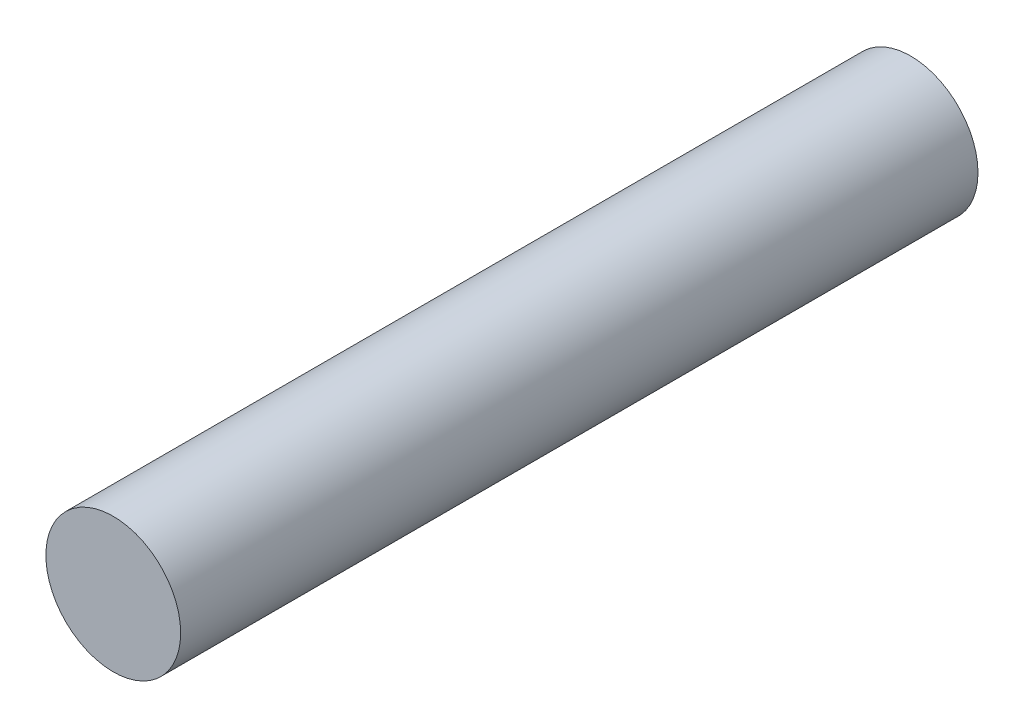
ISO-10303-21;
HEADER;
FILE_DESCRIPTION(('STEP AP214'),'2;1');
FILE_NAME('part.step','',(''),(''),'','','');
FILE_SCHEMA(('AUTOMOTIVE_DESIGN { 1 0 10303 214 1 1 1 1 }'));
ENDSEC;
DATA;
#1=APPLICATION_CONTEXT('core data for automotive mechanical design processes');
#2=APPLICATION_PROTOCOL_DEFINITION('international standard','automotive_design',2000,#1);
#3=PRODUCT_CONTEXT('',#1,'mechanical');
#4=PRODUCT('Part','Part','',(#3));
#5=PRODUCT_RELATED_PRODUCT_CATEGORY('part','',(#4));
#6=PRODUCT_DEFINITION_FORMATION('','',#4);
#7=PRODUCT_DEFINITION_CONTEXT('part definition',#1,'design');
#8=PRODUCT_DEFINITION('design','',#6,#7);
#9=PRODUCT_DEFINITION_SHAPE('','',#8);
#10=(LENGTH_UNIT() NAMED_UNIT(*) SI_UNIT(.MILLI.,.METRE.));
#11=(NAMED_UNIT(*) PLANE_ANGLE_UNIT() SI_UNIT($,.RADIAN.));
#12=(NAMED_UNIT(*) SI_UNIT($,.STERADIAN.) SOLID_ANGLE_UNIT());
#13=UNCERTAINTY_MEASURE_WITH_UNIT(LENGTH_MEASURE(1.E-05),#10,'distance_accuracy_value','');
#14=(GEOMETRIC_REPRESENTATION_CONTEXT(3) GLOBAL_UNCERTAINTY_ASSIGNED_CONTEXT((#13)) GLOBAL_UNIT_ASSIGNED_CONTEXT((#10,
#11,#12)) REPRESENTATION_CONTEXT('',''));
#15=CARTESIAN_POINT('',(0.,0.,0.));
#16=DIRECTION('',(0.,0.,1.));
#17=DIRECTION('',(1.,0.,0.));
#18=AXIS2_PLACEMENT_3D('',#15,#16,#17);
#19=CARTESIAN_POINT('',(6.23338385328465,6.25212212829109,29.5));
#20=DIRECTION('',(0.,0.,-1.));
#21=DIRECTION('',(-1.,0.,0.));
#22=AXIS2_PLACEMENT_3D('',#19,#20,#21);
#23=CYLINDRICAL_SURFACE('',#22,2.49364062066099);
#24=CARTESIAN_POINT('',(6.23338385328465,6.25212212829109,29.5));
#25=DIRECTION('',(0.,0.,1.));
#26=DIRECTION('',(1.,0.,0.));
#27=AXIS2_PLACEMENT_3D('',#24,#25,#26);
#28=CIRCLE('',#27,2.49364062066099);
#29=CARTESIAN_POINT('',(8.72702447394563,6.25212212829109,29.5));
#30=VERTEX_POINT('',#29);
#31=EDGE_CURVE('E10',#30,#30,#28,.T.);
#32=ORIENTED_EDGE('',*,*,#31,.F.);
#33=EDGE_LOOP('',(#32));
#34=FACE_BOUND('',#33,.T.);
#35=CARTESIAN_POINT('',(6.23338385328465,6.25212212829109,0.));
#36=DIRECTION('',(0.,0.,1.));
#37=DIRECTION('',(1.,0.,0.));
#38=AXIS2_PLACEMENT_3D('',#35,#36,#37);
#39=CIRCLE('',#38,2.49364062066099);
#40=CARTESIAN_POINT('',(8.72702447394563,6.25212212829109,0.));
#41=VERTEX_POINT('',#40);
#42=EDGE_CURVE('E40',#41,#41,#39,.T.);
#43=ORIENTED_EDGE('',*,*,#42,.T.);
#44=EDGE_LOOP('',(#43));
#45=FACE_BOUND('',#44,.T.);
#46=ADVANCED_FACE('F37',(#34,#45),#23,.T.);
#47=CARTESIAN_POINT('',(6.23338385328465,6.25212212829109,29.5));
#48=DIRECTION('',(0.,0.,1.));
#49=DIRECTION('',(1.,0.,0.));
#50=AXIS2_PLACEMENT_3D('',#47,#48,#49);
#51=PLANE('',#50);
#52=ORIENTED_EDGE('',*,*,#31,.T.);
#53=EDGE_LOOP('',(#52));
#54=FACE_BOUND('',#53,.T.);
#55=ADVANCED_FACE('F52',(#54),#51,.T.);
#56=CARTESIAN_POINT('',(6.23338385328465,6.25212212829109,0.));
#57=DIRECTION('',(0.,0.,1.));
#58=DIRECTION('',(1.,0.,0.));
#59=AXIS2_PLACEMENT_3D('',#56,#57,#58);
#60=PLANE('',#59);
#61=ORIENTED_EDGE('',*,*,#42,.F.);
#62=EDGE_LOOP('',(#61));
#63=FACE_BOUND('',#62,.T.);
#64=ADVANCED_FACE('F50',(#63),#60,.F.);
#65=CLOSED_SHELL('',(#46,#55,#64));
#66=MANIFOLD_SOLID_BREP('B2',#65);
#67=ADVANCED_BREP_SHAPE_REPRESENTATION('',(#18,#66),#14);
#68=SHAPE_DEFINITION_REPRESENTATION(#9,#67);
ENDSEC;
END-ISO-10303-21;
